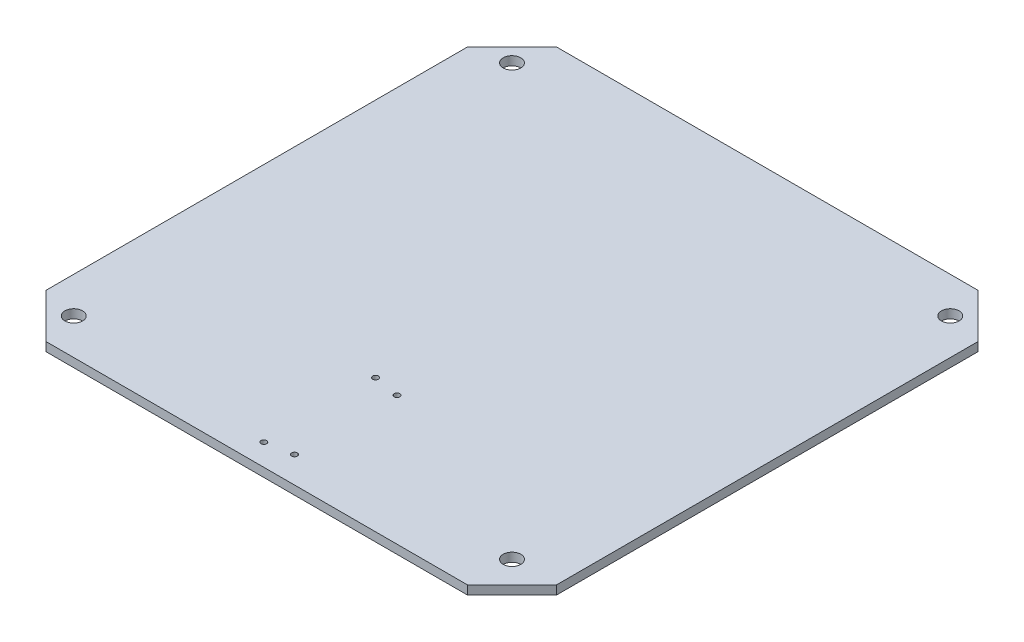
ISO-10303-21;
HEADER;
FILE_DESCRIPTION(('STEP AP214'),'2;1');
FILE_NAME('part.step','',(''),(''),'','','');
FILE_SCHEMA(('AUTOMOTIVE_DESIGN { 1 0 10303 214 1 1 1 1 }'));
ENDSEC;
DATA;
#1=APPLICATION_CONTEXT('core data for automotive mechanical design processes');
#2=APPLICATION_PROTOCOL_DEFINITION('international standard','automotive_design',2000,#1);
#3=PRODUCT_CONTEXT('',#1,'mechanical');
#4=PRODUCT('Part','Part','',(#3));
#5=PRODUCT_RELATED_PRODUCT_CATEGORY('part','',(#4));
#6=PRODUCT_DEFINITION_FORMATION('','',#4);
#7=PRODUCT_DEFINITION_CONTEXT('part definition',#1,'design');
#8=PRODUCT_DEFINITION('design','',#6,#7);
#9=PRODUCT_DEFINITION_SHAPE('','',#8);
#10=(LENGTH_UNIT() NAMED_UNIT(*) SI_UNIT(.MILLI.,.METRE.));
#11=(NAMED_UNIT(*) PLANE_ANGLE_UNIT() SI_UNIT($,.RADIAN.));
#12=(NAMED_UNIT(*) SI_UNIT($,.STERADIAN.) SOLID_ANGLE_UNIT());
#13=UNCERTAINTY_MEASURE_WITH_UNIT(LENGTH_MEASURE(1.E-05),#10,'distance_accuracy_value','');
#14=(GEOMETRIC_REPRESENTATION_CONTEXT(3) GLOBAL_UNCERTAINTY_ASSIGNED_CONTEXT((#13)) GLOBAL_UNIT_ASSIGNED_CONTEXT((#10,
#11,#12)) REPRESENTATION_CONTEXT('',''));
#15=CARTESIAN_POINT('',(0.,0.,0.));
#16=DIRECTION('',(0.,0.,1.));
#17=DIRECTION('',(1.,0.,0.));
#18=AXIS2_PLACEMENT_3D('',#15,#16,#17);
#19=CARTESIAN_POINT('',(-46.,1.59,38.));
#20=DIRECTION('',(0.707106781186547,0.,-0.707106781186548));
#21=DIRECTION('',(-0.707106781186548,0.,-0.707106781186547));
#22=AXIS2_PLACEMENT_3D('',#19,#20,#21);
#23=PLANE('',#22);
#24=DIRECTION('',(0.707106781186548,0.,0.707106781186547));
#25=VECTOR('',#24,1.);
#26=CARTESIAN_POINT('',(-46.,0.,38.));
#27=LINE('',#26,#25);
#28=CARTESIAN_POINT('',(-46.,0.,38.));
#29=VERTEX_POINT('',#28);
#30=CARTESIAN_POINT('',(-38.,0.,46.));
#31=VERTEX_POINT('',#30);
#32=EDGE_CURVE('E140',#29,#31,#27,.T.);
#33=ORIENTED_EDGE('',*,*,#32,.T.);
#34=DIRECTION('',(0.,-1.,0.));
#35=VECTOR('',#34,1.);
#36=CARTESIAN_POINT('',(-38.,1.59,46.));
#37=LINE('',#36,#35);
#38=CARTESIAN_POINT('',(-38.,1.59,46.));
#39=VERTEX_POINT('',#38);
#40=EDGE_CURVE('E11',#39,#31,#37,.T.);
#41=ORIENTED_EDGE('',*,*,#40,.F.);
#42=DIRECTION('',(0.707106781186548,0.,0.707106781186547));
#43=VECTOR('',#42,1.);
#44=CARTESIAN_POINT('',(-46.,1.59,38.));
#45=LINE('',#44,#43);
#46=CARTESIAN_POINT('',(-46.,1.59,38.));
#47=VERTEX_POINT('',#46);
#48=EDGE_CURVE('E169',#47,#39,#45,.T.);
#49=ORIENTED_EDGE('',*,*,#48,.F.);
#50=DIRECTION('',(0.,-1.,0.));
#51=VECTOR('',#50,1.);
#52=CARTESIAN_POINT('',(-46.,1.59,38.));
#53=LINE('',#52,#51);
#54=EDGE_CURVE('E56',#47,#29,#53,.T.);
#55=ORIENTED_EDGE('',*,*,#54,.T.);
#56=EDGE_LOOP('',(#33,#41,#49,#55));
#57=FACE_BOUND('',#56,.T.);
#58=ADVANCED_FACE('F39',(#57),#23,.F.);
#59=CARTESIAN_POINT('',(-38.,1.59,46.));
#60=DIRECTION('',(0.,0.,-1.));
#61=DIRECTION('',(-1.,0.,0.));
#62=AXIS2_PLACEMENT_3D('',#59,#60,#61);
#63=PLANE('',#62);
#64=DIRECTION('',(1.,0.,0.));
#65=VECTOR('',#64,1.);
#66=CARTESIAN_POINT('',(-38.,0.,46.));
#67=LINE('',#66,#65);
#68=CARTESIAN_POINT('',(38.,0.,46.));
#69=VERTEX_POINT('',#68);
#70=EDGE_CURVE('E143',#31,#69,#67,.T.);
#71=ORIENTED_EDGE('',*,*,#70,.T.);
#72=DIRECTION('',(0.,-1.,0.));
#73=VECTOR('',#72,1.);
#74=CARTESIAN_POINT('',(38.,1.59,46.));
#75=LINE('',#74,#73);
#76=CARTESIAN_POINT('',(38.,1.59,46.));
#77=VERTEX_POINT('',#76);
#78=EDGE_CURVE('E48',#77,#69,#75,.T.);
#79=ORIENTED_EDGE('',*,*,#78,.F.);
#80=DIRECTION('',(1.,0.,0.));
#81=VECTOR('',#80,1.);
#82=CARTESIAN_POINT('',(-38.,1.59,46.));
#83=LINE('',#82,#81);
#84=EDGE_CURVE('E94',#39,#77,#83,.T.);
#85=ORIENTED_EDGE('',*,*,#84,.F.);
#86=ORIENTED_EDGE('',*,*,#40,.T.);
#87=EDGE_LOOP('',(#71,#79,#85,#86));
#88=FACE_BOUND('',#87,.T.);
#89=ADVANCED_FACE('F188',(#88),#63,.F.);
#90=CARTESIAN_POINT('',(46.,1.59,38.));
#91=DIRECTION('',(0.707106781186548,0.,0.707106781186547));
#92=DIRECTION('',(0.707106781186547,0.,-0.707106781186548));
#93=AXIS2_PLACEMENT_3D('',#90,#91,#92);
#94=PLANE('',#93);
#95=DIRECTION('',(-0.707106781186547,0.,0.707106781186548));
#96=VECTOR('',#95,1.);
#97=CARTESIAN_POINT('',(46.,0.,38.));
#98=LINE('',#97,#96);
#99=CARTESIAN_POINT('',(46.,0.,38.));
#100=VERTEX_POINT('',#99);
#101=EDGE_CURVE('E148',#100,#69,#98,.T.);
#102=ORIENTED_EDGE('',*,*,#101,.F.);
#103=DIRECTION('',(0.,-1.,0.));
#104=VECTOR('',#103,1.);
#105=CARTESIAN_POINT('',(46.,1.59,38.));
#106=LINE('',#105,#104);
#107=CARTESIAN_POINT('',(46.,1.59,38.));
#108=VERTEX_POINT('',#107);
#109=EDGE_CURVE('E179',#108,#100,#106,.T.);
#110=ORIENTED_EDGE('',*,*,#109,.F.);
#111=DIRECTION('',(-0.707106781186547,0.,0.707106781186548));
#112=VECTOR('',#111,1.);
#113=CARTESIAN_POINT('',(46.,1.59,38.));
#114=LINE('',#113,#112);
#115=EDGE_CURVE('E187',#108,#77,#114,.T.);
#116=ORIENTED_EDGE('',*,*,#115,.T.);
#117=ORIENTED_EDGE('',*,*,#78,.T.);
#118=EDGE_LOOP('',(#102,#110,#116,#117));
#119=FACE_BOUND('',#118,.T.);
#120=ADVANCED_FACE('F185',(#119),#94,.T.);
#121=CARTESIAN_POINT('',(46.,1.59,38.));
#122=DIRECTION('',(-1.,0.,0.));
#123=DIRECTION('',(0.,0.,1.));
#124=AXIS2_PLACEMENT_3D('',#121,#122,#123);
#125=PLANE('',#124);
#126=DIRECTION('',(0.,0.,-1.));
#127=VECTOR('',#126,1.);
#128=CARTESIAN_POINT('',(46.,0.,38.));
#129=LINE('',#128,#127);
#130=CARTESIAN_POINT('',(46.,0.,-38.));
#131=VERTEX_POINT('',#130);
#132=EDGE_CURVE('E152',#100,#131,#129,.T.);
#133=ORIENTED_EDGE('',*,*,#132,.T.);
#134=DIRECTION('',(0.,-1.,0.));
#135=VECTOR('',#134,1.);
#136=CARTESIAN_POINT('',(46.,1.59,-38.));
#137=LINE('',#136,#135);
#138=CARTESIAN_POINT('',(46.,1.59,-38.));
#139=VERTEX_POINT('',#138);
#140=EDGE_CURVE('E176',#139,#131,#137,.T.);
#141=ORIENTED_EDGE('',*,*,#140,.F.);
#142=DIRECTION('',(0.,0.,-1.));
#143=VECTOR('',#142,1.);
#144=CARTESIAN_POINT('',(46.,1.59,38.));
#145=LINE('',#144,#143);
#146=EDGE_CURVE('E198',#108,#139,#145,.T.);
#147=ORIENTED_EDGE('',*,*,#146,.F.);
#148=ORIENTED_EDGE('',*,*,#109,.T.);
#149=EDGE_LOOP('',(#133,#141,#147,#148));
#150=FACE_BOUND('',#149,.T.);
#151=ADVANCED_FACE('F196',(#150),#125,.F.);
#152=CARTESIAN_POINT('',(38.,1.59,-46.));
#153=DIRECTION('',(0.707106781186547,0.,-0.707106781186547));
#154=DIRECTION('',(-0.707106781186548,0.,-0.707106781186548));
#155=AXIS2_PLACEMENT_3D('',#152,#153,#154);
#156=PLANE('',#155);
#157=DIRECTION('',(0.707106781186548,0.,0.707106781186548));
#158=VECTOR('',#157,1.);
#159=CARTESIAN_POINT('',(38.,0.,-46.));
#160=LINE('',#159,#158);
#161=CARTESIAN_POINT('',(38.,0.,-46.));
#162=VERTEX_POINT('',#161);
#163=EDGE_CURVE('E156',#162,#131,#160,.T.);
#164=ORIENTED_EDGE('',*,*,#163,.F.);
#165=DIRECTION('',(0.,-1.,0.));
#166=VECTOR('',#165,1.);
#167=CARTESIAN_POINT('',(38.,1.59,-46.));
#168=LINE('',#167,#166);
#169=CARTESIAN_POINT('',(38.,1.59,-46.));
#170=VERTEX_POINT('',#169);
#171=EDGE_CURVE('E120',#170,#162,#168,.T.);
#172=ORIENTED_EDGE('',*,*,#171,.F.);
#173=DIRECTION('',(0.707106781186548,0.,0.707106781186548));
#174=VECTOR('',#173,1.);
#175=CARTESIAN_POINT('',(38.,1.59,-46.));
#176=LINE('',#175,#174);
#177=EDGE_CURVE('E129',#170,#139,#176,.T.);
#178=ORIENTED_EDGE('',*,*,#177,.T.);
#179=ORIENTED_EDGE('',*,*,#140,.T.);
#180=EDGE_LOOP('',(#164,#172,#178,#179));
#181=FACE_BOUND('',#180,.T.);
#182=ADVANCED_FACE('F208',(#181),#156,.T.);
#183=CARTESIAN_POINT('',(-38.,1.59,-46.));
#184=DIRECTION('',(0.,0.,-1.));
#185=DIRECTION('',(-1.,0.,0.));
#186=AXIS2_PLACEMENT_3D('',#183,#184,#185);
#187=PLANE('',#186);
#188=DIRECTION('',(1.,0.,0.));
#189=VECTOR('',#188,1.);
#190=CARTESIAN_POINT('',(-38.,0.,-46.));
#191=LINE('',#190,#189);
#192=CARTESIAN_POINT('',(-38.,0.,-46.));
#193=VERTEX_POINT('',#192);
#194=EDGE_CURVE('E115',#193,#162,#191,.T.);
#195=ORIENTED_EDGE('',*,*,#194,.F.);
#196=DIRECTION('',(0.,-1.,0.));
#197=VECTOR('',#196,1.);
#198=CARTESIAN_POINT('',(-38.,1.59,-46.));
#199=LINE('',#198,#197);
#200=CARTESIAN_POINT('',(-38.,1.59,-46.));
#201=VERTEX_POINT('',#200);
#202=EDGE_CURVE('E110',#201,#193,#199,.T.);
#203=ORIENTED_EDGE('',*,*,#202,.F.);
#204=DIRECTION('',(1.,0.,0.));
#205=VECTOR('',#204,1.);
#206=CARTESIAN_POINT('',(-38.,1.59,-46.));
#207=LINE('',#206,#205);
#208=EDGE_CURVE('E113',#201,#170,#207,.T.);
#209=ORIENTED_EDGE('',*,*,#208,.T.);
#210=ORIENTED_EDGE('',*,*,#171,.T.);
#211=EDGE_LOOP('',(#195,#203,#209,#210));
#212=FACE_BOUND('',#211,.T.);
#213=ADVANCED_FACE('F112',(#212),#187,.T.);
#214=CARTESIAN_POINT('',(-46.,1.59,-38.));
#215=DIRECTION('',(-0.707106781186547,0.,-0.707106781186547));
#216=DIRECTION('',(-0.707106781186548,0.,0.707106781186548));
#217=AXIS2_PLACEMENT_3D('',#214,#215,#216);
#218=PLANE('',#217);
#219=DIRECTION('',(0.707106781186548,0.,-0.707106781186548));
#220=VECTOR('',#219,1.);
#221=CARTESIAN_POINT('',(-46.,0.,-38.));
#222=LINE('',#221,#220);
#223=CARTESIAN_POINT('',(-46.,0.,-38.));
#224=VERTEX_POINT('',#223);
#225=EDGE_CURVE('E162',#224,#193,#222,.T.);
#226=ORIENTED_EDGE('',*,*,#225,.F.);
#227=DIRECTION('',(0.,-1.,0.));
#228=VECTOR('',#227,1.);
#229=CARTESIAN_POINT('',(-46.,1.59,-38.));
#230=LINE('',#229,#228);
#231=CARTESIAN_POINT('',(-46.,1.59,-38.));
#232=VERTEX_POINT('',#231);
#233=EDGE_CURVE('E82',#232,#224,#230,.T.);
#234=ORIENTED_EDGE('',*,*,#233,.F.);
#235=DIRECTION('',(0.707106781186548,0.,-0.707106781186548));
#236=VECTOR('',#235,1.);
#237=CARTESIAN_POINT('',(-46.,1.59,-38.));
#238=LINE('',#237,#236);
#239=EDGE_CURVE('E127',#232,#201,#238,.T.);
#240=ORIENTED_EDGE('',*,*,#239,.T.);
#241=ORIENTED_EDGE('',*,*,#202,.T.);
#242=EDGE_LOOP('',(#226,#234,#240,#241));
#243=FACE_BOUND('',#242,.T.);
#244=ADVANCED_FACE('F132',(#243),#218,.T.);
#245=CARTESIAN_POINT('',(-46.,1.59,38.));
#246=DIRECTION('',(-1.,0.,0.));
#247=DIRECTION('',(0.,0.,1.));
#248=AXIS2_PLACEMENT_3D('',#245,#246,#247);
#249=PLANE('',#248);
#250=DIRECTION('',(0.,0.,-1.));
#251=VECTOR('',#250,1.);
#252=CARTESIAN_POINT('',(-46.,0.,38.));
#253=LINE('',#252,#251);
#254=EDGE_CURVE('E165',#29,#224,#253,.T.);
#255=ORIENTED_EDGE('',*,*,#254,.F.);
#256=ORIENTED_EDGE('',*,*,#54,.F.);
#257=DIRECTION('',(0.,0.,-1.));
#258=VECTOR('',#257,1.);
#259=CARTESIAN_POINT('',(-46.,1.59,38.));
#260=LINE('',#259,#258);
#261=EDGE_CURVE('E134',#47,#232,#260,.T.);
#262=ORIENTED_EDGE('',*,*,#261,.T.);
#263=ORIENTED_EDGE('',*,*,#233,.T.);
#264=EDGE_LOOP('',(#255,#256,#262,#263));
#265=FACE_BOUND('',#264,.T.);
#266=ADVANCED_FACE('F209',(#265),#249,.T.);
#267=CARTESIAN_POINT('',(0.,1.59,0.));
#268=DIRECTION('',(0.,-1.,0.));
#269=DIRECTION('',(0.,0.,-1.));
#270=AXIS2_PLACEMENT_3D('',#267,#268,#269);
#271=PLANE('',#270);
#272=CARTESIAN_POINT('',(39.5,1.59,-39.5));
#273=DIRECTION('',(0.,1.,0.));
#274=DIRECTION('',(0.,0.,1.));
#275=AXIS2_PLACEMENT_3D('',#272,#273,#274);
#276=CIRCLE('',#275,1.59);
#277=CARTESIAN_POINT('',(39.5,1.59,-37.91));
#278=VERTEX_POINT('',#277);
#279=EDGE_CURVE('E259',#278,#278,#276,.T.);
#280=ORIENTED_EDGE('',*,*,#279,.F.);
#281=EDGE_LOOP('',(#280));
#282=FACE_BOUND('',#281,.T.);
#283=CARTESIAN_POINT('',(38.,1.59,38.));
#284=DIRECTION('',(0.,1.,0.));
#285=DIRECTION('',(0.,0.,1.));
#286=AXIS2_PLACEMENT_3D('',#283,#284,#285);
#287=CIRCLE('',#286,1.59);
#288=CARTESIAN_POINT('',(38.,1.59,39.59));
#289=VERTEX_POINT('',#288);
#290=EDGE_CURVE('E251',#289,#289,#287,.T.);
#291=ORIENTED_EDGE('',*,*,#290,.F.);
#292=EDGE_LOOP('',(#291));
#293=FACE_BOUND('',#292,.T.);
#294=CARTESIAN_POINT('',(-39.5,1.59,39.5));
#295=DIRECTION('',(0.,1.,0.));
#296=DIRECTION('',(0.,0.,1.));
#297=AXIS2_PLACEMENT_3D('',#294,#295,#296);
#298=CIRCLE('',#297,1.59);
#299=CARTESIAN_POINT('',(-39.5,1.59,41.09));
#300=VERTEX_POINT('',#299);
#301=EDGE_CURVE('E243',#300,#300,#298,.T.);
#302=ORIENTED_EDGE('',*,*,#301,.F.);
#303=EDGE_LOOP('',(#302));
#304=FACE_BOUND('',#303,.T.);
#305=CARTESIAN_POINT('',(-2.67,1.59,21.93));
#306=DIRECTION('',(0.,1.,0.));
#307=DIRECTION('',(0.,0.,1.));
#308=AXIS2_PLACEMENT_3D('',#305,#306,#307);
#309=CIRCLE('',#308,0.509999999999999);
#310=CARTESIAN_POINT('',(-2.67,1.59,22.44));
#311=VERTEX_POINT('',#310);
#312=EDGE_CURVE('E234',#311,#311,#309,.T.);
#313=ORIENTED_EDGE('',*,*,#312,.F.);
#314=EDGE_LOOP('',(#313));
#315=FACE_BOUND('',#314,.T.);
#316=CARTESIAN_POINT('',(2.03000000000001,1.59,41.24));
#317=DIRECTION('',(0.,1.,0.));
#318=DIRECTION('',(0.,0.,1.));
#319=AXIS2_PLACEMENT_3D('',#316,#317,#318);
#320=CIRCLE('',#319,0.510000000000002);
#321=CARTESIAN_POINT('',(2.03000000000001,1.59,41.75));
#322=VERTEX_POINT('',#321);
#323=EDGE_CURVE('E282',#322,#322,#320,.T.);
#324=ORIENTED_EDGE('',*,*,#323,.F.);
#325=EDGE_LOOP('',(#324));
#326=FACE_BOUND('',#325,.T.);
#327=CARTESIAN_POINT('',(-2.67,1.59,42.07));
#328=DIRECTION('',(0.,1.,0.));
#329=DIRECTION('',(0.,0.,1.));
#330=AXIS2_PLACEMENT_3D('',#327,#328,#329);
#331=CIRCLE('',#330,0.510000000000002);
#332=CARTESIAN_POINT('',(-2.67,1.59,42.58));
#333=VERTEX_POINT('',#332);
#334=EDGE_CURVE('E266',#333,#333,#331,.T.);
#335=ORIENTED_EDGE('',*,*,#334,.F.);
#336=EDGE_LOOP('',(#335));
#337=FACE_BOUND('',#336,.T.);
#338=CARTESIAN_POINT('',(2.03000000000001,1.59,22.75));
#339=DIRECTION('',(0.,1.,0.));
#340=DIRECTION('',(0.,0.,1.));
#341=AXIS2_PLACEMENT_3D('',#338,#339,#340);
#342=CIRCLE('',#341,0.509999999999999);
#343=CARTESIAN_POINT('',(2.03000000000001,1.59,23.26));
#344=VERTEX_POINT('',#343);
#345=EDGE_CURVE('E275',#344,#344,#342,.T.);
#346=ORIENTED_EDGE('',*,*,#345,.F.);
#347=EDGE_LOOP('',(#346));
#348=FACE_BOUND('',#347,.T.);
#349=CARTESIAN_POINT('',(-39.5,1.59,-39.5));
#350=DIRECTION('',(0.,1.,0.));
#351=DIRECTION('',(0.,0.,1.));
#352=AXIS2_PLACEMENT_3D('',#349,#350,#351);
#353=CIRCLE('',#352,1.59);
#354=CARTESIAN_POINT('',(-39.5,1.59,-37.91));
#355=VERTEX_POINT('',#354);
#356=EDGE_CURVE('E226',#355,#355,#353,.T.);
#357=ORIENTED_EDGE('',*,*,#356,.F.);
#358=EDGE_LOOP('',(#357));
#359=FACE_BOUND('',#358,.T.);
#360=ORIENTED_EDGE('',*,*,#48,.T.);
#361=ORIENTED_EDGE('',*,*,#84,.T.);
#362=ORIENTED_EDGE('',*,*,#115,.F.);
#363=ORIENTED_EDGE('',*,*,#146,.T.);
#364=ORIENTED_EDGE('',*,*,#177,.F.);
#365=ORIENTED_EDGE('',*,*,#208,.F.);
#366=ORIENTED_EDGE('',*,*,#239,.F.);
#367=ORIENTED_EDGE('',*,*,#261,.F.);
#368=EDGE_LOOP('',(#360,#361,#362,#363,#364,#365,#366,#367));
#369=FACE_BOUND('',#368,.T.);
#370=ADVANCED_FACE('F125',(#282,#293,#304,#315,#326,#337,#348,#359,#369),#271,.F.);
#371=CARTESIAN_POINT('',(0.,0.,0.));
#372=DIRECTION('',(0.,-1.,0.));
#373=DIRECTION('',(0.,0.,-1.));
#374=AXIS2_PLACEMENT_3D('',#371,#372,#373);
#375=PLANE('',#374);
#376=CARTESIAN_POINT('',(39.5,0.,-39.5));
#377=DIRECTION('',(0.,1.,0.));
#378=DIRECTION('',(0.,0.,1.));
#379=AXIS2_PLACEMENT_3D('',#376,#377,#378);
#380=CIRCLE('',#379,1.59);
#381=CARTESIAN_POINT('',(39.5,0.,-37.91));
#382=VERTEX_POINT('',#381);
#383=EDGE_CURVE('E230',#382,#382,#380,.T.);
#384=ORIENTED_EDGE('',*,*,#383,.T.);
#385=EDGE_LOOP('',(#384));
#386=FACE_BOUND('',#385,.T.);
#387=CARTESIAN_POINT('',(38.,0.,38.));
#388=DIRECTION('',(0.,1.,0.));
#389=DIRECTION('',(0.,0.,1.));
#390=AXIS2_PLACEMENT_3D('',#387,#388,#389);
#391=CIRCLE('',#390,1.59);
#392=CARTESIAN_POINT('',(38.,0.,39.59));
#393=VERTEX_POINT('',#392);
#394=EDGE_CURVE('E255',#393,#393,#391,.T.);
#395=ORIENTED_EDGE('',*,*,#394,.T.);
#396=EDGE_LOOP('',(#395));
#397=FACE_BOUND('',#396,.T.);
#398=CARTESIAN_POINT('',(-39.5,0.,39.5));
#399=DIRECTION('',(0.,1.,0.));
#400=DIRECTION('',(0.,0.,1.));
#401=AXIS2_PLACEMENT_3D('',#398,#399,#400);
#402=CIRCLE('',#401,1.59);
#403=CARTESIAN_POINT('',(-39.5,0.,41.09));
#404=VERTEX_POINT('',#403);
#405=EDGE_CURVE('E247',#404,#404,#402,.T.);
#406=ORIENTED_EDGE('',*,*,#405,.T.);
#407=EDGE_LOOP('',(#406));
#408=FACE_BOUND('',#407,.T.);
#409=CARTESIAN_POINT('',(-2.67,0.,21.93));
#410=DIRECTION('',(0.,1.,0.));
#411=DIRECTION('',(0.,0.,1.));
#412=AXIS2_PLACEMENT_3D('',#409,#410,#411);
#413=CIRCLE('',#412,0.509999999999999);
#414=CARTESIAN_POINT('',(-2.67,0.,22.44));
#415=VERTEX_POINT('',#414);
#416=EDGE_CURVE('E238',#415,#415,#413,.T.);
#417=ORIENTED_EDGE('',*,*,#416,.T.);
#418=EDGE_LOOP('',(#417));
#419=FACE_BOUND('',#418,.T.);
#420=CARTESIAN_POINT('',(2.03000000000001,0.,41.24));
#421=DIRECTION('',(0.,1.,0.));
#422=DIRECTION('',(0.,0.,1.));
#423=AXIS2_PLACEMENT_3D('',#420,#421,#422);
#424=CIRCLE('',#423,0.510000000000002);
#425=CARTESIAN_POINT('',(2.03000000000001,0.,41.75));
#426=VERTEX_POINT('',#425);
#427=EDGE_CURVE('E271',#426,#426,#424,.T.);
#428=ORIENTED_EDGE('',*,*,#427,.T.);
#429=EDGE_LOOP('',(#428));
#430=FACE_BOUND('',#429,.T.);
#431=CARTESIAN_POINT('',(-2.67,0.,42.07));
#432=DIRECTION('',(0.,1.,0.));
#433=DIRECTION('',(0.,0.,1.));
#434=AXIS2_PLACEMENT_3D('',#431,#432,#433);
#435=CIRCLE('',#434,0.510000000000002);
#436=CARTESIAN_POINT('',(-2.67,0.,42.58));
#437=VERTEX_POINT('',#436);
#438=EDGE_CURVE('E270',#437,#437,#435,.T.);
#439=ORIENTED_EDGE('',*,*,#438,.T.);
#440=EDGE_LOOP('',(#439));
#441=FACE_BOUND('',#440,.T.);
#442=CARTESIAN_POINT('',(2.03000000000001,0.,22.75));
#443=DIRECTION('',(0.,1.,0.));
#444=DIRECTION('',(0.,0.,1.));
#445=AXIS2_PLACEMENT_3D('',#442,#443,#444);
#446=CIRCLE('',#445,0.509999999999999);
#447=CARTESIAN_POINT('',(2.03000000000001,0.,23.26));
#448=VERTEX_POINT('',#447);
#449=EDGE_CURVE('E239',#448,#448,#446,.T.);
#450=ORIENTED_EDGE('',*,*,#449,.T.);
#451=EDGE_LOOP('',(#450));
#452=FACE_BOUND('',#451,.T.);
#453=CARTESIAN_POINT('',(-39.5,0.,-39.5));
#454=DIRECTION('',(0.,1.,0.));
#455=DIRECTION('',(0.,0.,1.));
#456=AXIS2_PLACEMENT_3D('',#453,#454,#455);
#457=CIRCLE('',#456,1.59);
#458=CARTESIAN_POINT('',(-39.5,0.,-37.91));
#459=VERTEX_POINT('',#458);
#460=EDGE_CURVE('E144',#459,#459,#457,.T.);
#461=ORIENTED_EDGE('',*,*,#460,.T.);
#462=EDGE_LOOP('',(#461));
#463=FACE_BOUND('',#462,.T.);
#464=ORIENTED_EDGE('',*,*,#32,.F.);
#465=ORIENTED_EDGE('',*,*,#254,.T.);
#466=ORIENTED_EDGE('',*,*,#225,.T.);
#467=ORIENTED_EDGE('',*,*,#194,.T.);
#468=ORIENTED_EDGE('',*,*,#163,.T.);
#469=ORIENTED_EDGE('',*,*,#132,.F.);
#470=ORIENTED_EDGE('',*,*,#101,.T.);
#471=ORIENTED_EDGE('',*,*,#70,.F.);
#472=EDGE_LOOP('',(#464,#465,#466,#467,#468,#469,#470,#471));
#473=FACE_BOUND('',#472,.T.);
#474=ADVANCED_FACE('F192',(#386,#397,#408,#419,#430,#441,#452,#463,#473),#375,.T.);
#475=CARTESIAN_POINT('',(-39.5,0.,-39.5));
#476=DIRECTION('',(0.,1.,0.));
#477=DIRECTION('',(0.,0.,1.));
#478=AXIS2_PLACEMENT_3D('',#475,#476,#477);
#479=CYLINDRICAL_SURFACE('',#478,1.59);
#480=CARTESIAN_POINT('',(-39.5,0.,-37.91));
#481=CARTESIAN_POINT('',(-39.5,0.0165625,-37.91));
#482=CARTESIAN_POINT('',(-39.5,0.033125,-37.91));
#483=CARTESIAN_POINT('',(-39.5,0.06625,-37.91));
#484=CARTESIAN_POINT('',(-39.5,0.0828125,-37.91));
#485=CARTESIAN_POINT('',(-39.5,0.1159375,-37.91));
#486=CARTESIAN_POINT('',(-39.5,0.1325,-37.91));
#487=CARTESIAN_POINT('',(-39.5,0.165625,-37.91));
#488=CARTESIAN_POINT('',(-39.5,0.1821875,-37.91));
#489=CARTESIAN_POINT('',(-39.5,0.2153125,-37.91));
#490=CARTESIAN_POINT('',(-39.5,0.231875,-37.91));
#491=CARTESIAN_POINT('',(-39.5,0.265,-37.91));
#492=CARTESIAN_POINT('',(-39.5,0.2815625,-37.91));
#493=CARTESIAN_POINT('',(-39.5,0.3146875,-37.91));
#494=CARTESIAN_POINT('',(-39.5,0.33125,-37.91));
#495=CARTESIAN_POINT('',(-39.5,0.364375,-37.91));
#496=CARTESIAN_POINT('',(-39.5,0.3809375,-37.91));
#497=CARTESIAN_POINT('',(-39.5,0.4140625,-37.91));
#498=CARTESIAN_POINT('',(-39.5,0.430625,-37.91));
#499=CARTESIAN_POINT('',(-39.5,0.46375,-37.91));
#500=CARTESIAN_POINT('',(-39.5,0.4803125,-37.91));
#501=CARTESIAN_POINT('',(-39.5,0.5134375,-37.91));
#502=CARTESIAN_POINT('',(-39.5,0.53,-37.91));
#503=CARTESIAN_POINT('',(-39.5,0.563125,-37.91));
#504=CARTESIAN_POINT('',(-39.5,0.5796875,-37.91));
#505=CARTESIAN_POINT('',(-39.5,0.6128125,-37.91));
#506=CARTESIAN_POINT('',(-39.5,0.629375,-37.91));
#507=CARTESIAN_POINT('',(-39.5,0.6625,-37.91));
#508=CARTESIAN_POINT('',(-39.5,0.6790625,-37.91));
#509=CARTESIAN_POINT('',(-39.5,0.7121875,-37.91));
#510=CARTESIAN_POINT('',(-39.5,0.72875,-37.91));
#511=CARTESIAN_POINT('',(-39.5,0.761875,-37.91));
#512=CARTESIAN_POINT('',(-39.5,0.7784375,-37.91));
#513=CARTESIAN_POINT('',(-39.5,0.8115625,-37.91));
#514=CARTESIAN_POINT('',(-39.5,0.828125,-37.91));
#515=CARTESIAN_POINT('',(-39.5,0.86125,-37.91));
#516=CARTESIAN_POINT('',(-39.5,0.8778125,-37.91));
#517=CARTESIAN_POINT('',(-39.5,0.9109375,-37.91));
#518=CARTESIAN_POINT('',(-39.5,0.9275,-37.91));
#519=CARTESIAN_POINT('',(-39.5,0.960625,-37.91));
#520=CARTESIAN_POINT('',(-39.5,0.9771875,-37.91));
#521=CARTESIAN_POINT('',(-39.5,1.0103125,-37.91));
#522=CARTESIAN_POINT('',(-39.5,1.026875,-37.91));
#523=CARTESIAN_POINT('',(-39.5,1.06,-37.91));
#524=CARTESIAN_POINT('',(-39.5,1.0765625,-37.91));
#525=CARTESIAN_POINT('',(-39.5,1.1096875,-37.91));
#526=CARTESIAN_POINT('',(-39.5,1.12625,-37.91));
#527=CARTESIAN_POINT('',(-39.5,1.159375,-37.91));
#528=CARTESIAN_POINT('',(-39.5,1.1759375,-37.91));
#529=CARTESIAN_POINT('',(-39.5,1.2090625,-37.91));
#530=CARTESIAN_POINT('',(-39.5,1.225625,-37.91));
#531=CARTESIAN_POINT('',(-39.5,1.25875,-37.91));
#532=CARTESIAN_POINT('',(-39.5,1.2753125,-37.91));
#533=CARTESIAN_POINT('',(-39.5,1.3084375,-37.91));
#534=CARTESIAN_POINT('',(-39.5,1.325,-37.91));
#535=CARTESIAN_POINT('',(-39.5,1.358125,-37.91));
#536=CARTESIAN_POINT('',(-39.5,1.3746875,-37.91));
#537=CARTESIAN_POINT('',(-39.5,1.4078125,-37.91));
#538=CARTESIAN_POINT('',(-39.5,1.424375,-37.91));
#539=CARTESIAN_POINT('',(-39.5,1.4575,-37.91));
#540=CARTESIAN_POINT('',(-39.5,1.4740625,-37.91));
#541=CARTESIAN_POINT('',(-39.5,1.5071875,-37.91));
#542=CARTESIAN_POINT('',(-39.5,1.52375,-37.91));
#543=CARTESIAN_POINT('',(-39.5,1.556875,-37.91));
#544=CARTESIAN_POINT('',(-39.5,1.5734375,-37.91));
#545=CARTESIAN_POINT('',(-39.5,1.59,-37.91));
#546=B_SPLINE_CURVE_WITH_KNOTS('',3,(#480,#481,#482,#483,#484,#485,#486,#487,#488,#489,#490,
#491,#492,#493,#494,#495,#496,#497,#498,#499,#500,#501,#502,#503,#504,#505,#506,#507,#508,#509,
#510,#511,#512,#513,#514,#515,#516,#517,#518,#519,#520,#521,#522,#523,#524,#525,#526,#527,#528,
#529,#530,#531,#532,#533,#534,#535,#536,#537,#538,#539,#540,#541,#542,#543,#544,#545),
.UNSPECIFIED.,.F.,.F.,(4,2,2,2,2,2,2,2,2,2,2,2,2,2,2,2,2,2,2,2,2,2,2,2,2,2,2,2,2,2,2,2,4),(0.,
0.0496875,0.099375,0.1490625,0.19875,0.2484375,0.298125,0.3478125,0.3975,0.4471875,0.496875,
0.5465625,0.59625,0.6459375,0.695625,0.7453125,0.795,0.8446875,0.894375,0.9440625,0.99375,
1.0434375,1.093125,1.1428125,1.1925,1.2421875,1.291875,1.3415625,1.39125,1.4409375,1.490625,
1.5403125,1.59),.UNSPECIFIED.);
#547=EDGE_CURVE('BSEAM307',#459,#355,#546,.T.);
#548=ORIENTED_EDGE('',*,*,#460,.F.);
#549=ORIENTED_EDGE('',*,*,#356,.T.);
#550=ORIENTED_EDGE('',*,*,#547,.T.);
#551=ORIENTED_EDGE('',*,*,#547,.F.);
#552=EDGE_LOOP('',(#548,#550,#549,#551));
#553=FACE_BOUND('',#552,.T.);
#554=ADVANCED_FACE('F307',(#553),#479,.F.);
#555=CARTESIAN_POINT('',(2.03000000000001,0.,22.75));
#556=DIRECTION('',(0.,1.,0.));
#557=DIRECTION('',(0.,0.,1.));
#558=AXIS2_PLACEMENT_3D('',#555,#556,#557);
#559=CYLINDRICAL_SURFACE('',#558,0.509999999999999);
#560=ORIENTED_EDGE('',*,*,#449,.F.);
#561=EDGE_LOOP('',(#560));
#562=FACE_BOUND('',#561,.T.);
#563=ORIENTED_EDGE('',*,*,#345,.T.);
#564=EDGE_LOOP('',(#563));
#565=FACE_BOUND('',#564,.T.);
#566=ADVANCED_FACE('F309',(#562,#565),#559,.F.);
#567=CARTESIAN_POINT('',(-2.67,0.,42.07));
#568=DIRECTION('',(0.,1.,0.));
#569=DIRECTION('',(0.,0.,1.));
#570=AXIS2_PLACEMENT_3D('',#567,#568,#569);
#571=CYLINDRICAL_SURFACE('',#570,0.510000000000002);
#572=ORIENTED_EDGE('',*,*,#438,.F.);
#573=EDGE_LOOP('',(#572));
#574=FACE_BOUND('',#573,.T.);
#575=ORIENTED_EDGE('',*,*,#334,.T.);
#576=EDGE_LOOP('',(#575));
#577=FACE_BOUND('',#576,.T.);
#578=ADVANCED_FACE('F296',(#574,#577),#571,.F.);
#579=CARTESIAN_POINT('',(2.03000000000001,0.,41.24));
#580=DIRECTION('',(0.,1.,0.));
#581=DIRECTION('',(0.,0.,1.));
#582=AXIS2_PLACEMENT_3D('',#579,#580,#581);
#583=CYLINDRICAL_SURFACE('',#582,0.510000000000002);
#584=ORIENTED_EDGE('',*,*,#427,.F.);
#585=EDGE_LOOP('',(#584));
#586=FACE_BOUND('',#585,.T.);
#587=ORIENTED_EDGE('',*,*,#323,.T.);
#588=EDGE_LOOP('',(#587));
#589=FACE_BOUND('',#588,.T.);
#590=ADVANCED_FACE('F292',(#586,#589),#583,.F.);
#591=CARTESIAN_POINT('',(-2.67,0.,21.93));
#592=DIRECTION('',(0.,1.,0.));
#593=DIRECTION('',(0.,0.,1.));
#594=AXIS2_PLACEMENT_3D('',#591,#592,#593);
#595=CYLINDRICAL_SURFACE('',#594,0.509999999999999);
#596=ORIENTED_EDGE('',*,*,#416,.F.);
#597=EDGE_LOOP('',(#596));
#598=FACE_BOUND('',#597,.T.);
#599=ORIENTED_EDGE('',*,*,#312,.T.);
#600=EDGE_LOOP('',(#599));
#601=FACE_BOUND('',#600,.T.);
#602=ADVANCED_FACE('F295',(#598,#601),#595,.F.);
#603=CARTESIAN_POINT('',(-39.5,0.,39.5));
#604=DIRECTION('',(0.,1.,0.));
#605=DIRECTION('',(0.,0.,1.));
#606=AXIS2_PLACEMENT_3D('',#603,#604,#605);
#607=CYLINDRICAL_SURFACE('',#606,1.59);
#608=CARTESIAN_POINT('',(-39.5,0.,41.09));
#609=CARTESIAN_POINT('',(-39.5,0.0165625,41.09));
#610=CARTESIAN_POINT('',(-39.5,0.033125,41.09));
#611=CARTESIAN_POINT('',(-39.5,0.06625,41.09));
#612=CARTESIAN_POINT('',(-39.5,0.0828125,41.09));
#613=CARTESIAN_POINT('',(-39.5,0.1159375,41.09));
#614=CARTESIAN_POINT('',(-39.5,0.1325,41.09));
#615=CARTESIAN_POINT('',(-39.5,0.165625,41.09));
#616=CARTESIAN_POINT('',(-39.5,0.1821875,41.09));
#617=CARTESIAN_POINT('',(-39.5,0.2153125,41.09));
#618=CARTESIAN_POINT('',(-39.5,0.231875,41.09));
#619=CARTESIAN_POINT('',(-39.5,0.265,41.09));
#620=CARTESIAN_POINT('',(-39.5,0.2815625,41.09));
#621=CARTESIAN_POINT('',(-39.5,0.3146875,41.09));
#622=CARTESIAN_POINT('',(-39.5,0.33125,41.09));
#623=CARTESIAN_POINT('',(-39.5,0.364375,41.09));
#624=CARTESIAN_POINT('',(-39.5,0.3809375,41.09));
#625=CARTESIAN_POINT('',(-39.5,0.4140625,41.09));
#626=CARTESIAN_POINT('',(-39.5,0.430625,41.09));
#627=CARTESIAN_POINT('',(-39.5,0.46375,41.09));
#628=CARTESIAN_POINT('',(-39.5,0.4803125,41.09));
#629=CARTESIAN_POINT('',(-39.5,0.5134375,41.09));
#630=CARTESIAN_POINT('',(-39.5,0.53,41.09));
#631=CARTESIAN_POINT('',(-39.5,0.563125,41.09));
#632=CARTESIAN_POINT('',(-39.5,0.5796875,41.09));
#633=CARTESIAN_POINT('',(-39.5,0.6128125,41.09));
#634=CARTESIAN_POINT('',(-39.5,0.629375,41.09));
#635=CARTESIAN_POINT('',(-39.5,0.6625,41.09));
#636=CARTESIAN_POINT('',(-39.5,0.6790625,41.09));
#637=CARTESIAN_POINT('',(-39.5,0.7121875,41.09));
#638=CARTESIAN_POINT('',(-39.5,0.72875,41.09));
#639=CARTESIAN_POINT('',(-39.5,0.761875,41.09));
#640=CARTESIAN_POINT('',(-39.5,0.7784375,41.09));
#641=CARTESIAN_POINT('',(-39.5,0.8115625,41.09));
#642=CARTESIAN_POINT('',(-39.5,0.828125,41.09));
#643=CARTESIAN_POINT('',(-39.5,0.86125,41.09));
#644=CARTESIAN_POINT('',(-39.5,0.8778125,41.09));
#645=CARTESIAN_POINT('',(-39.5,0.9109375,41.09));
#646=CARTESIAN_POINT('',(-39.5,0.9275,41.09));
#647=CARTESIAN_POINT('',(-39.5,0.960625,41.09));
#648=CARTESIAN_POINT('',(-39.5,0.9771875,41.09));
#649=CARTESIAN_POINT('',(-39.5,1.0103125,41.09));
#650=CARTESIAN_POINT('',(-39.5,1.026875,41.09));
#651=CARTESIAN_POINT('',(-39.5,1.06,41.09));
#652=CARTESIAN_POINT('',(-39.5,1.0765625,41.09));
#653=CARTESIAN_POINT('',(-39.5,1.1096875,41.09));
#654=CARTESIAN_POINT('',(-39.5,1.12625,41.09));
#655=CARTESIAN_POINT('',(-39.5,1.159375,41.09));
#656=CARTESIAN_POINT('',(-39.5,1.1759375,41.09));
#657=CARTESIAN_POINT('',(-39.5,1.2090625,41.09));
#658=CARTESIAN_POINT('',(-39.5,1.225625,41.09));
#659=CARTESIAN_POINT('',(-39.5,1.25875,41.09));
#660=CARTESIAN_POINT('',(-39.5,1.2753125,41.09));
#661=CARTESIAN_POINT('',(-39.5,1.3084375,41.09));
#662=CARTESIAN_POINT('',(-39.5,1.325,41.09));
#663=CARTESIAN_POINT('',(-39.5,1.358125,41.09));
#664=CARTESIAN_POINT('',(-39.5,1.3746875,41.09));
#665=CARTESIAN_POINT('',(-39.5,1.4078125,41.09));
#666=CARTESIAN_POINT('',(-39.5,1.424375,41.09));
#667=CARTESIAN_POINT('',(-39.5,1.4575,41.09));
#668=CARTESIAN_POINT('',(-39.5,1.4740625,41.09));
#669=CARTESIAN_POINT('',(-39.5,1.5071875,41.09));
#670=CARTESIAN_POINT('',(-39.5,1.52375,41.09));
#671=CARTESIAN_POINT('',(-39.5,1.556875,41.09));
#672=CARTESIAN_POINT('',(-39.5,1.5734375,41.09));
#673=CARTESIAN_POINT('',(-39.5,1.59,41.09));
#674=B_SPLINE_CURVE_WITH_KNOTS('',3,(#608,#609,#610,#611,#612,#613,#614,#615,#616,#617,#618,
#619,#620,#621,#622,#623,#624,#625,#626,#627,#628,#629,#630,#631,#632,#633,#634,#635,#636,#637,
#638,#639,#640,#641,#642,#643,#644,#645,#646,#647,#648,#649,#650,#651,#652,#653,#654,#655,#656,
#657,#658,#659,#660,#661,#662,#663,#664,#665,#666,#667,#668,#669,#670,#671,#672,#673),
.UNSPECIFIED.,.F.,.F.,(4,2,2,2,2,2,2,2,2,2,2,2,2,2,2,2,2,2,2,2,2,2,2,2,2,2,2,2,2,2,2,2,4),(0.,
0.0496875,0.099375,0.1490625,0.19875,0.2484375,0.298125,0.3478125,0.3975,0.4471875,0.496875,
0.5465625,0.59625,0.6459375,0.695625,0.7453125,0.795,0.8446875,0.894375,0.9440625,0.99375,
1.0434375,1.093125,1.1428125,1.1925,1.2421875,1.291875,1.3415625,1.39125,1.4409375,1.490625,
1.5403125,1.59),.UNSPECIFIED.);
#675=EDGE_CURVE('BSEAM323',#404,#300,#674,.T.);
#676=ORIENTED_EDGE('',*,*,#405,.F.);
#677=ORIENTED_EDGE('',*,*,#301,.T.);
#678=ORIENTED_EDGE('',*,*,#675,.T.);
#679=ORIENTED_EDGE('',*,*,#675,.F.);
#680=EDGE_LOOP('',(#676,#678,#677,#679));
#681=FACE_BOUND('',#680,.T.);
#682=ADVANCED_FACE('F323',(#681),#607,.F.);
#683=CARTESIAN_POINT('',(38.,0.,38.));
#684=DIRECTION('',(0.,1.,0.));
#685=DIRECTION('',(0.,0.,1.));
#686=AXIS2_PLACEMENT_3D('',#683,#684,#685);
#687=CYLINDRICAL_SURFACE('',#686,1.59);
#688=CARTESIAN_POINT('',(38.,0.,39.59));
#689=CARTESIAN_POINT('',(38.,0.0165625,39.59));
#690=CARTESIAN_POINT('',(38.,0.033125,39.59));
#691=CARTESIAN_POINT('',(38.,0.06625,39.59));
#692=CARTESIAN_POINT('',(38.,0.0828125,39.59));
#693=CARTESIAN_POINT('',(38.,0.1159375,39.59));
#694=CARTESIAN_POINT('',(38.,0.1325,39.59));
#695=CARTESIAN_POINT('',(38.,0.165625,39.59));
#696=CARTESIAN_POINT('',(38.,0.1821875,39.59));
#697=CARTESIAN_POINT('',(38.,0.2153125,39.59));
#698=CARTESIAN_POINT('',(38.,0.231875,39.59));
#699=CARTESIAN_POINT('',(38.,0.265,39.59));
#700=CARTESIAN_POINT('',(38.,0.2815625,39.59));
#701=CARTESIAN_POINT('',(38.,0.3146875,39.59));
#702=CARTESIAN_POINT('',(38.,0.33125,39.59));
#703=CARTESIAN_POINT('',(38.,0.364375,39.59));
#704=CARTESIAN_POINT('',(38.,0.3809375,39.59));
#705=CARTESIAN_POINT('',(38.,0.4140625,39.59));
#706=CARTESIAN_POINT('',(38.,0.430625,39.59));
#707=CARTESIAN_POINT('',(38.,0.46375,39.59));
#708=CARTESIAN_POINT('',(38.,0.4803125,39.59));
#709=CARTESIAN_POINT('',(38.,0.5134375,39.59));
#710=CARTESIAN_POINT('',(38.,0.53,39.59));
#711=CARTESIAN_POINT('',(38.,0.563125,39.59));
#712=CARTESIAN_POINT('',(38.,0.5796875,39.59));
#713=CARTESIAN_POINT('',(38.,0.6128125,39.59));
#714=CARTESIAN_POINT('',(38.,0.629375,39.59));
#715=CARTESIAN_POINT('',(38.,0.6625,39.59));
#716=CARTESIAN_POINT('',(38.,0.6790625,39.59));
#717=CARTESIAN_POINT('',(38.,0.7121875,39.59));
#718=CARTESIAN_POINT('',(38.,0.72875,39.59));
#719=CARTESIAN_POINT('',(38.,0.761875,39.59));
#720=CARTESIAN_POINT('',(38.,0.7784375,39.59));
#721=CARTESIAN_POINT('',(38.,0.8115625,39.59));
#722=CARTESIAN_POINT('',(38.,0.828125,39.59));
#723=CARTESIAN_POINT('',(38.,0.86125,39.59));
#724=CARTESIAN_POINT('',(38.,0.8778125,39.59));
#725=CARTESIAN_POINT('',(38.,0.9109375,39.59));
#726=CARTESIAN_POINT('',(38.,0.9275,39.59));
#727=CARTESIAN_POINT('',(38.,0.960625,39.59));
#728=CARTESIAN_POINT('',(38.,0.9771875,39.59));
#729=CARTESIAN_POINT('',(38.,1.0103125,39.59));
#730=CARTESIAN_POINT('',(38.,1.026875,39.59));
#731=CARTESIAN_POINT('',(38.,1.06,39.59));
#732=CARTESIAN_POINT('',(38.,1.0765625,39.59));
#733=CARTESIAN_POINT('',(38.,1.1096875,39.59));
#734=CARTESIAN_POINT('',(38.,1.12625,39.59));
#735=CARTESIAN_POINT('',(38.,1.159375,39.59));
#736=CARTESIAN_POINT('',(38.,1.1759375,39.59));
#737=CARTESIAN_POINT('',(38.,1.2090625,39.59));
#738=CARTESIAN_POINT('',(38.,1.225625,39.59));
#739=CARTESIAN_POINT('',(38.,1.25875,39.59));
#740=CARTESIAN_POINT('',(38.,1.2753125,39.59));
#741=CARTESIAN_POINT('',(38.,1.3084375,39.59));
#742=CARTESIAN_POINT('',(38.,1.325,39.59));
#743=CARTESIAN_POINT('',(38.,1.358125,39.59));
#744=CARTESIAN_POINT('',(38.,1.3746875,39.59));
#745=CARTESIAN_POINT('',(38.,1.4078125,39.59));
#746=CARTESIAN_POINT('',(38.,1.424375,39.59));
#747=CARTESIAN_POINT('',(38.,1.4575,39.59));
#748=CARTESIAN_POINT('',(38.,1.4740625,39.59));
#749=CARTESIAN_POINT('',(38.,1.5071875,39.59));
#750=CARTESIAN_POINT('',(38.,1.52375,39.59));
#751=CARTESIAN_POINT('',(38.,1.556875,39.59));
#752=CARTESIAN_POINT('',(38.,1.5734375,39.59));
#753=CARTESIAN_POINT('',(38.,1.59,39.59));
#754=B_SPLINE_CURVE_WITH_KNOTS('',3,(#688,#689,#690,#691,#692,#693,#694,#695,#696,#697,#698,
#699,#700,#701,#702,#703,#704,#705,#706,#707,#708,#709,#710,#711,#712,#713,#714,#715,#716,#717,
#718,#719,#720,#721,#722,#723,#724,#725,#726,#727,#728,#729,#730,#731,#732,#733,#734,#735,#736,
#737,#738,#739,#740,#741,#742,#743,#744,#745,#746,#747,#748,#749,#750,#751,#752,#753),
.UNSPECIFIED.,.F.,.F.,(4,2,2,2,2,2,2,2,2,2,2,2,2,2,2,2,2,2,2,2,2,2,2,2,2,2,2,2,2,2,2,2,4),(0.,
0.0496875,0.099375,0.1490625,0.19875,0.2484375,0.298125,0.3478125,0.3975,0.4471875,0.496875,
0.5465625,0.59625,0.6459375,0.695625,0.7453125,0.795,0.8446875,0.894375,0.9440625,0.99375,
1.0434375,1.093125,1.1428125,1.1925,1.2421875,1.291875,1.3415625,1.39125,1.4409375,1.490625,
1.5403125,1.59),.UNSPECIFIED.);
#755=EDGE_CURVE('BSEAM327',#393,#289,#754,.T.);
#756=ORIENTED_EDGE('',*,*,#394,.F.);
#757=ORIENTED_EDGE('',*,*,#290,.T.);
#758=ORIENTED_EDGE('',*,*,#755,.T.);
#759=ORIENTED_EDGE('',*,*,#755,.F.);
#760=EDGE_LOOP('',(#756,#758,#757,#759));
#761=FACE_BOUND('',#760,.T.);
#762=ADVANCED_FACE('F327',(#761),#687,.F.);
#763=CARTESIAN_POINT('',(39.5,0.,-39.5));
#764=DIRECTION('',(0.,1.,0.));
#765=DIRECTION('',(0.,0.,1.));
#766=AXIS2_PLACEMENT_3D('',#763,#764,#765);
#767=CYLINDRICAL_SURFACE('',#766,1.59);
#768=CARTESIAN_POINT('',(39.5,0.,-37.91));
#769=CARTESIAN_POINT('',(39.5,0.0165625,-37.91));
#770=CARTESIAN_POINT('',(39.5,0.033125,-37.91));
#771=CARTESIAN_POINT('',(39.5,0.06625,-37.91));
#772=CARTESIAN_POINT('',(39.5,0.0828125,-37.91));
#773=CARTESIAN_POINT('',(39.5,0.1159375,-37.91));
#774=CARTESIAN_POINT('',(39.5,0.1325,-37.91));
#775=CARTESIAN_POINT('',(39.5,0.165625,-37.91));
#776=CARTESIAN_POINT('',(39.5,0.1821875,-37.91));
#777=CARTESIAN_POINT('',(39.5,0.2153125,-37.91));
#778=CARTESIAN_POINT('',(39.5,0.231875,-37.91));
#779=CARTESIAN_POINT('',(39.5,0.265,-37.91));
#780=CARTESIAN_POINT('',(39.5,0.2815625,-37.91));
#781=CARTESIAN_POINT('',(39.5,0.3146875,-37.91));
#782=CARTESIAN_POINT('',(39.5,0.33125,-37.91));
#783=CARTESIAN_POINT('',(39.5,0.364375,-37.91));
#784=CARTESIAN_POINT('',(39.5,0.3809375,-37.91));
#785=CARTESIAN_POINT('',(39.5,0.4140625,-37.91));
#786=CARTESIAN_POINT('',(39.5,0.430625,-37.91));
#787=CARTESIAN_POINT('',(39.5,0.46375,-37.91));
#788=CARTESIAN_POINT('',(39.5,0.4803125,-37.91));
#789=CARTESIAN_POINT('',(39.5,0.5134375,-37.91));
#790=CARTESIAN_POINT('',(39.5,0.53,-37.91));
#791=CARTESIAN_POINT('',(39.5,0.563125,-37.91));
#792=CARTESIAN_POINT('',(39.5,0.5796875,-37.91));
#793=CARTESIAN_POINT('',(39.5,0.6128125,-37.91));
#794=CARTESIAN_POINT('',(39.5,0.629375,-37.91));
#795=CARTESIAN_POINT('',(39.5,0.6625,-37.91));
#796=CARTESIAN_POINT('',(39.5,0.6790625,-37.91));
#797=CARTESIAN_POINT('',(39.5,0.7121875,-37.91));
#798=CARTESIAN_POINT('',(39.5,0.72875,-37.91));
#799=CARTESIAN_POINT('',(39.5,0.761875,-37.91));
#800=CARTESIAN_POINT('',(39.5,0.7784375,-37.91));
#801=CARTESIAN_POINT('',(39.5,0.8115625,-37.91));
#802=CARTESIAN_POINT('',(39.5,0.828125,-37.91));
#803=CARTESIAN_POINT('',(39.5,0.86125,-37.91));
#804=CARTESIAN_POINT('',(39.5,0.8778125,-37.91));
#805=CARTESIAN_POINT('',(39.5,0.9109375,-37.91));
#806=CARTESIAN_POINT('',(39.5,0.9275,-37.91));
#807=CARTESIAN_POINT('',(39.5,0.960625,-37.91));
#808=CARTESIAN_POINT('',(39.5,0.9771875,-37.91));
#809=CARTESIAN_POINT('',(39.5,1.0103125,-37.91));
#810=CARTESIAN_POINT('',(39.5,1.026875,-37.91));
#811=CARTESIAN_POINT('',(39.5,1.06,-37.91));
#812=CARTESIAN_POINT('',(39.5,1.0765625,-37.91));
#813=CARTESIAN_POINT('',(39.5,1.1096875,-37.91));
#814=CARTESIAN_POINT('',(39.5,1.12625,-37.91));
#815=CARTESIAN_POINT('',(39.5,1.159375,-37.91));
#816=CARTESIAN_POINT('',(39.5,1.1759375,-37.91));
#817=CARTESIAN_POINT('',(39.5,1.2090625,-37.91));
#818=CARTESIAN_POINT('',(39.5,1.225625,-37.91));
#819=CARTESIAN_POINT('',(39.5,1.25875,-37.91));
#820=CARTESIAN_POINT('',(39.5,1.2753125,-37.91));
#821=CARTESIAN_POINT('',(39.5,1.3084375,-37.91));
#822=CARTESIAN_POINT('',(39.5,1.325,-37.91));
#823=CARTESIAN_POINT('',(39.5,1.358125,-37.91));
#824=CARTESIAN_POINT('',(39.5,1.3746875,-37.91));
#825=CARTESIAN_POINT('',(39.5,1.4078125,-37.91));
#826=CARTESIAN_POINT('',(39.5,1.424375,-37.91));
#827=CARTESIAN_POINT('',(39.5,1.4575,-37.91));
#828=CARTESIAN_POINT('',(39.5,1.4740625,-37.91));
#829=CARTESIAN_POINT('',(39.5,1.5071875,-37.91));
#830=CARTESIAN_POINT('',(39.5,1.52375,-37.91));
#831=CARTESIAN_POINT('',(39.5,1.556875,-37.91));
#832=CARTESIAN_POINT('',(39.5,1.5734375,-37.91));
#833=CARTESIAN_POINT('',(39.5,1.59,-37.91));
#834=B_SPLINE_CURVE_WITH_KNOTS('',3,(#768,#769,#770,#771,#772,#773,#774,#775,#776,#777,#778,
#779,#780,#781,#782,#783,#784,#785,#786,#787,#788,#789,#790,#791,#792,#793,#794,#795,#796,#797,
#798,#799,#800,#801,#802,#803,#804,#805,#806,#807,#808,#809,#810,#811,#812,#813,#814,#815,#816,
#817,#818,#819,#820,#821,#822,#823,#824,#825,#826,#827,#828,#829,#830,#831,#832,#833),
.UNSPECIFIED.,.F.,.F.,(4,2,2,2,2,2,2,2,2,2,2,2,2,2,2,2,2,2,2,2,2,2,2,2,2,2,2,2,2,2,2,2,4),(0.,
0.0496875,0.099375,0.1490625,0.19875,0.2484375,0.298125,0.3478125,0.3975,0.4471875,0.496875,
0.5465625,0.59625,0.6459375,0.695625,0.7453125,0.795,0.8446875,0.894375,0.9440625,0.99375,
1.0434375,1.093125,1.1428125,1.1925,1.2421875,1.291875,1.3415625,1.39125,1.4409375,1.490625,
1.5403125,1.59),.UNSPECIFIED.);
#835=EDGE_CURVE('BSEAM331',#382,#278,#834,.T.);
#836=ORIENTED_EDGE('',*,*,#383,.F.);
#837=ORIENTED_EDGE('',*,*,#279,.T.);
#838=ORIENTED_EDGE('',*,*,#835,.T.);
#839=ORIENTED_EDGE('',*,*,#835,.F.);
#840=EDGE_LOOP('',(#836,#838,#837,#839));
#841=FACE_BOUND('',#840,.T.);
#842=ADVANCED_FACE('F331',(#841),#767,.F.);
#843=CLOSED_SHELL('',(#58,#89,#120,#151,#182,#213,#244,#266,#370,#474,#554,#566,#578,#590,#602,
#682,#762,#842));
#844=MANIFOLD_SOLID_BREP('B2',#843);
#845=ADVANCED_BREP_SHAPE_REPRESENTATION('',(#18,#844),#14);
#846=SHAPE_DEFINITION_REPRESENTATION(#9,#845);
ENDSEC;
END-ISO-10303-21;
